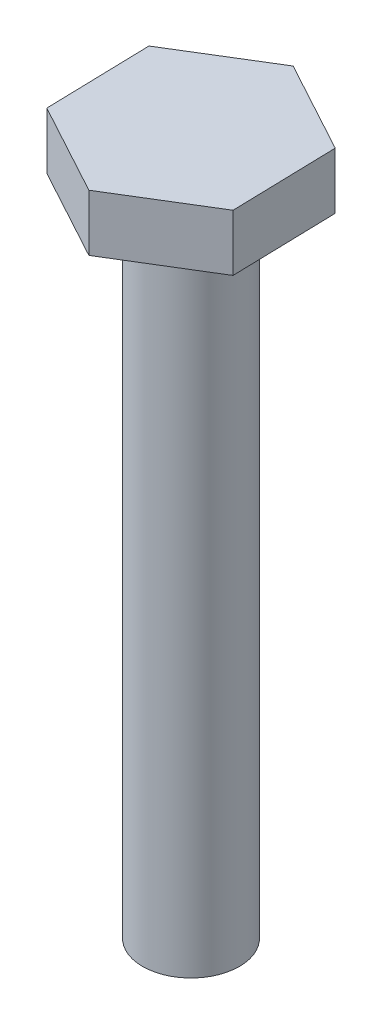
ISO-10303-21;
HEADER;
FILE_DESCRIPTION(('STEP AP214'),'2;1');
FILE_NAME('part.step','',(''),(''),'','','');
FILE_SCHEMA(('AUTOMOTIVE_DESIGN { 1 0 10303 214 1 1 1 1 }'));
ENDSEC;
DATA;
#1=APPLICATION_CONTEXT('core data for automotive mechanical design processes');
#2=APPLICATION_PROTOCOL_DEFINITION('international standard','automotive_design',2000,#1);
#3=PRODUCT_CONTEXT('',#1,'mechanical');
#4=PRODUCT('Part','Part','',(#3));
#5=PRODUCT_RELATED_PRODUCT_CATEGORY('part','',(#4));
#6=PRODUCT_DEFINITION_FORMATION('','',#4);
#7=PRODUCT_DEFINITION_CONTEXT('part definition',#1,'design');
#8=PRODUCT_DEFINITION('design','',#6,#7);
#9=PRODUCT_DEFINITION_SHAPE('','',#8);
#10=(LENGTH_UNIT() NAMED_UNIT(*) SI_UNIT(.MILLI.,.METRE.));
#11=(NAMED_UNIT(*) PLANE_ANGLE_UNIT() SI_UNIT($,.RADIAN.));
#12=(NAMED_UNIT(*) SI_UNIT($,.STERADIAN.) SOLID_ANGLE_UNIT());
#13=UNCERTAINTY_MEASURE_WITH_UNIT(LENGTH_MEASURE(1.E-05),#10,'distance_accuracy_value','');
#14=(GEOMETRIC_REPRESENTATION_CONTEXT(3) GLOBAL_UNCERTAINTY_ASSIGNED_CONTEXT((#13)) GLOBAL_UNIT_ASSIGNED_CONTEXT((#10,
#11,#12)) REPRESENTATION_CONTEXT('',''));
#15=CARTESIAN_POINT('',(0.,0.,0.));
#16=DIRECTION('',(0.,0.,1.));
#17=DIRECTION('',(1.,0.,0.));
#18=AXIS2_PLACEMENT_3D('',#15,#16,#17);
#19=CARTESIAN_POINT('',(-0.167873016872767,3.5,-6.49783184225368));
#20=DIRECTION('',(-0.477466711370013,0.,0.878649838976543));
#21=DIRECTION('',(-0.878649838976543,0.,-0.477466711370013));
#22=AXIS2_PLACEMENT_3D('',#19,#20,#21);
#23=PLANE('',#22);
#24=DIRECTION('',(0.878649838976543,0.,0.477466711370013));
#25=VECTOR('',#24,1.);
#26=CARTESIAN_POINT('',(-0.167873016872767,0.,-6.49783184225368));
#27=LINE('',#26,#25);
#28=CARTESIAN_POINT('',(-0.167873016872767,0.,-6.49783184225368));
#29=VERTEX_POINT('',#28);
#30=CARTESIAN_POINT('',(5.54335093647476,0.,-3.3942982183486));
#31=VERTEX_POINT('',#30);
#32=EDGE_CURVE('E120',#29,#31,#27,.T.);
#33=ORIENTED_EDGE('',*,*,#32,.F.);
#34=DIRECTION('',(0.,-1.,0.));
#35=VECTOR('',#34,1.);
#36=CARTESIAN_POINT('',(-0.167873016872767,3.5,-6.49783184225368));
#37=LINE('',#36,#35);
#38=CARTESIAN_POINT('',(-0.167873016872767,3.5,-6.49783184225368));
#39=VERTEX_POINT('',#38);
#40=EDGE_CURVE('E119',#39,#29,#37,.T.);
#41=ORIENTED_EDGE('',*,*,#40,.F.);
#42=DIRECTION('',(0.878649838976543,0.,0.477466711370013));
#43=VECTOR('',#42,1.);
#44=CARTESIAN_POINT('',(-0.167873016872767,3.5,-6.49783184225368));
#45=LINE('',#44,#43);
#46=CARTESIAN_POINT('',(5.54335093647476,3.5,-3.3942982183486));
#47=VERTEX_POINT('',#46);
#48=EDGE_CURVE('E133',#39,#47,#45,.T.);
#49=ORIENTED_EDGE('',*,*,#48,.T.);
#50=DIRECTION('',(0.,-1.,0.));
#51=VECTOR('',#50,1.);
#52=CARTESIAN_POINT('',(5.54335093647476,3.5,-3.3942982183486));
#53=LINE('',#52,#51);
#54=EDGE_CURVE('E45',#47,#31,#53,.T.);
#55=ORIENTED_EDGE('',*,*,#54,.T.);
#56=EDGE_LOOP('',(#33,#41,#49,#55));
#57=FACE_BOUND('',#56,.T.);
#58=ADVANCED_FACE('F37',(#57),#23,.F.);
#59=CARTESIAN_POINT('',(5.54335093647476,3.5,-3.3942982183486));
#60=DIRECTION('',(-0.999666437269799,0.,0.0258266179804261));
#61=DIRECTION('',(-0.0258266179804261,0.,-0.999666437269799));
#62=AXIS2_PLACEMENT_3D('',#59,#60,#61);
#63=PLANE('',#62);
#64=DIRECTION('',(0.0258266179804261,0.,0.999666437269799));
#65=VECTOR('',#64,1.);
#66=CARTESIAN_POINT('',(5.54335093647476,0.,-3.3942982183486));
#67=LINE('',#66,#65);
#68=CARTESIAN_POINT('',(5.71122395334753,0.,3.10353362390509));
#69=VERTEX_POINT('',#68);
#70=EDGE_CURVE('E122',#31,#69,#67,.T.);
#71=ORIENTED_EDGE('',*,*,#70,.F.);
#72=ORIENTED_EDGE('',*,*,#54,.F.);
#73=DIRECTION('',(0.0258266179804261,0.,0.999666437269799));
#74=VECTOR('',#73,1.);
#75=CARTESIAN_POINT('',(5.54335093647476,3.5,-3.3942982183486));
#76=LINE('',#75,#74);
#77=CARTESIAN_POINT('',(5.71122395334753,3.5,3.10353362390509));
#78=VERTEX_POINT('',#77);
#79=EDGE_CURVE('E85',#47,#78,#76,.T.);
#80=ORIENTED_EDGE('',*,*,#79,.T.);
#81=DIRECTION('',(0.,-1.,0.));
#82=VECTOR('',#81,1.);
#83=CARTESIAN_POINT('',(5.71122395334753,3.5,3.10353362390509));
#84=LINE('',#83,#82);
#85=EDGE_CURVE('E137',#78,#69,#84,.T.);
#86=ORIENTED_EDGE('',*,*,#85,.T.);
#87=EDGE_LOOP('',(#71,#72,#80,#86));
#88=FACE_BOUND('',#87,.T.);
#89=ADVANCED_FACE('F146',(#88),#63,.F.);
#90=CARTESIAN_POINT('',(5.71122395334753,3.5,3.10353362390509));
#91=DIRECTION('',(-0.522199725899786,0.,-0.852823220996115));
#92=DIRECTION('',(0.852823220996115,0.,-0.522199725899786));
#93=AXIS2_PLACEMENT_3D('',#90,#91,#92);
#94=PLANE('',#93);
#95=DIRECTION('',(-0.852823220996115,0.,0.522199725899786));
#96=VECTOR('',#95,1.);
#97=CARTESIAN_POINT('',(5.71122395334753,0.,3.10353362390509));
#98=LINE('',#97,#96);
#99=CARTESIAN_POINT('',(0.167873016872779,0.,6.49783184225369));
#100=VERTEX_POINT('',#99);
#101=EDGE_CURVE('E126',#69,#100,#98,.T.);
#102=ORIENTED_EDGE('',*,*,#101,.F.);
#103=ORIENTED_EDGE('',*,*,#85,.F.);
#104=DIRECTION('',(-0.852823220996115,0.,0.522199725899786));
#105=VECTOR('',#104,1.);
#106=CARTESIAN_POINT('',(5.71122395334753,3.5,3.10353362390509));
#107=LINE('',#106,#105);
#108=CARTESIAN_POINT('',(0.167873016872779,3.5,6.49783184225369));
#109=VERTEX_POINT('',#108);
#110=EDGE_CURVE('E113',#78,#109,#107,.T.);
#111=ORIENTED_EDGE('',*,*,#110,.T.);
#112=DIRECTION('',(0.,-1.,0.));
#113=VECTOR('',#112,1.);
#114=CARTESIAN_POINT('',(0.167873016872779,3.5,6.49783184225369));
#115=LINE('',#114,#113);
#116=EDGE_CURVE('E107',#109,#100,#115,.T.);
#117=ORIENTED_EDGE('',*,*,#116,.T.);
#118=EDGE_LOOP('',(#102,#103,#111,#117));
#119=FACE_BOUND('',#118,.T.);
#120=ADVANCED_FACE('F149',(#119),#94,.F.);
#121=CARTESIAN_POINT('',(0.167873016872779,3.5,6.49783184225369));
#122=DIRECTION('',(0.477466711370013,0.,-0.878649838976543));
#123=DIRECTION('',(0.878649838976543,0.,0.477466711370013));
#124=AXIS2_PLACEMENT_3D('',#121,#122,#123);
#125=PLANE('',#124);
#126=DIRECTION('',(-0.878649838976543,0.,-0.477466711370013));
#127=VECTOR('',#126,1.);
#128=CARTESIAN_POINT('',(0.167873016872779,0.,6.49783184225369));
#129=LINE('',#128,#127);
#130=CARTESIAN_POINT('',(-5.54335093647474,0.,3.39429821834861));
#131=VERTEX_POINT('',#130);
#132=EDGE_CURVE('E129',#100,#131,#129,.T.);
#133=ORIENTED_EDGE('',*,*,#132,.F.);
#134=ORIENTED_EDGE('',*,*,#116,.F.);
#135=DIRECTION('',(-0.878649838976543,0.,-0.477466711370013));
#136=VECTOR('',#135,1.);
#137=CARTESIAN_POINT('',(0.167873016872779,3.5,6.49783184225369));
#138=LINE('',#137,#136);
#139=CARTESIAN_POINT('',(-5.54335093647474,3.5,3.39429821834861));
#140=VERTEX_POINT('',#139);
#141=EDGE_CURVE('E97',#109,#140,#138,.T.);
#142=ORIENTED_EDGE('',*,*,#141,.T.);
#143=DIRECTION('',(0.,-1.,0.));
#144=VECTOR('',#143,1.);
#145=CARTESIAN_POINT('',(-5.54335093647474,3.5,3.39429821834861));
#146=LINE('',#145,#144);
#147=EDGE_CURVE('E102',#140,#131,#146,.T.);
#148=ORIENTED_EDGE('',*,*,#147,.T.);
#149=EDGE_LOOP('',(#133,#134,#142,#148));
#150=FACE_BOUND('',#149,.T.);
#151=ADVANCED_FACE('F110',(#150),#125,.F.);
#152=CARTESIAN_POINT('',(-5.54335093647474,3.5,3.39429821834861));
#153=DIRECTION('',(0.999666437269799,0.,-0.0258266179804277));
#154=DIRECTION('',(0.0258266179804277,0.,0.999666437269799));
#155=AXIS2_PLACEMENT_3D('',#152,#153,#154);
#156=PLANE('',#155);
#157=DIRECTION('',(-0.0258266179804277,0.,-0.999666437269799));
#158=VECTOR('',#157,1.);
#159=CARTESIAN_POINT('',(-5.54335093647474,0.,3.39429821834861));
#160=LINE('',#159,#158);
#161=CARTESIAN_POINT('',(-5.71122395334752,0.,-3.10353362390507));
#162=VERTEX_POINT('',#161);
#163=EDGE_CURVE('E104',#131,#162,#160,.T.);
#164=ORIENTED_EDGE('',*,*,#163,.F.);
#165=ORIENTED_EDGE('',*,*,#147,.F.);
#166=DIRECTION('',(-0.0258266179804277,0.,-0.999666437269799));
#167=VECTOR('',#166,1.);
#168=CARTESIAN_POINT('',(-5.54335093647474,3.5,3.39429821834861));
#169=LINE('',#168,#167);
#170=CARTESIAN_POINT('',(-5.71122395334752,3.5,-3.10353362390507));
#171=VERTEX_POINT('',#170);
#172=EDGE_CURVE('E93',#140,#171,#169,.T.);
#173=ORIENTED_EDGE('',*,*,#172,.T.);
#174=DIRECTION('',(0.,-1.,0.));
#175=VECTOR('',#174,1.);
#176=CARTESIAN_POINT('',(-5.71122395334752,3.5,-3.10353362390507));
#177=LINE('',#176,#175);
#178=EDGE_CURVE('E108',#171,#162,#177,.T.);
#179=ORIENTED_EDGE('',*,*,#178,.T.);
#180=EDGE_LOOP('',(#164,#165,#173,#179));
#181=FACE_BOUND('',#180,.T.);
#182=ADVANCED_FACE('F103',(#181),#156,.F.);
#183=CARTESIAN_POINT('',(-5.71122395334752,3.5,-3.10353362390507));
#184=DIRECTION('',(0.522199725899786,0.,0.852823220996115));
#185=DIRECTION('',(-0.852823220996115,0.,0.522199725899786));
#186=AXIS2_PLACEMENT_3D('',#183,#184,#185);
#187=PLANE('',#186);
#188=DIRECTION('',(0.852823220996115,0.,-0.522199725899786));
#189=VECTOR('',#188,1.);
#190=CARTESIAN_POINT('',(-5.71122395334752,0.,-3.10353362390507));
#191=LINE('',#190,#189);
#192=EDGE_CURVE('E73',#162,#29,#191,.T.);
#193=ORIENTED_EDGE('',*,*,#192,.F.);
#194=ORIENTED_EDGE('',*,*,#178,.F.);
#195=DIRECTION('',(0.852823220996115,0.,-0.522199725899786));
#196=VECTOR('',#195,1.);
#197=CARTESIAN_POINT('',(-5.71122395334752,3.5,-3.10353362390507));
#198=LINE('',#197,#196);
#199=EDGE_CURVE('E53',#171,#39,#198,.T.);
#200=ORIENTED_EDGE('',*,*,#199,.T.);
#201=ORIENTED_EDGE('',*,*,#40,.T.);
#202=EDGE_LOOP('',(#193,#194,#200,#201));
#203=FACE_BOUND('',#202,.T.);
#204=ADVANCED_FACE('F183',(#203),#187,.F.);
#205=CARTESIAN_POINT('',(0.,3.5,0.));
#206=DIRECTION('',(0.,1.,0.));
#207=DIRECTION('',(0.,0.,-1.));
#208=AXIS2_PLACEMENT_3D('',#205,#206,#207);
#209=PLANE('',#208);
#210=ORIENTED_EDGE('',*,*,#48,.F.);
#211=ORIENTED_EDGE('',*,*,#199,.F.);
#212=ORIENTED_EDGE('',*,*,#172,.F.);
#213=ORIENTED_EDGE('',*,*,#141,.F.);
#214=ORIENTED_EDGE('',*,*,#110,.F.);
#215=ORIENTED_EDGE('',*,*,#79,.F.);
#216=EDGE_LOOP('',(#210,#211,#212,#213,#214,#215));
#217=FACE_BOUND('',#216,.T.);
#218=ADVANCED_FACE('F95',(#217),#209,.T.);
#219=CARTESIAN_POINT('',(0.,0.,0.));
#220=DIRECTION('',(0.,1.,0.));
#221=DIRECTION('',(0.,0.,-1.));
#222=AXIS2_PLACEMENT_3D('',#219,#220,#221);
#223=PLANE('',#222);
#224=CARTESIAN_POINT('',(0.,0.,0.));
#225=DIRECTION('',(0.,-1.,0.));
#226=DIRECTION('',(0.,0.,-1.));
#227=AXIS2_PLACEMENT_3D('',#224,#225,#226);
#228=CIRCLE('',#227,3.);
#229=CARTESIAN_POINT('',(0.,0.,-3.));
#230=VERTEX_POINT('',#229);
#231=EDGE_CURVE('E11',#230,#230,#228,.F.);
#232=ORIENTED_EDGE('',*,*,#231,.T.);
#233=EDGE_LOOP('',(#232));
#234=FACE_BOUND('',#233,.T.);
#235=ORIENTED_EDGE('',*,*,#32,.T.);
#236=ORIENTED_EDGE('',*,*,#70,.T.);
#237=ORIENTED_EDGE('',*,*,#101,.T.);
#238=ORIENTED_EDGE('',*,*,#132,.T.);
#239=ORIENTED_EDGE('',*,*,#163,.T.);
#240=ORIENTED_EDGE('',*,*,#192,.T.);
#241=EDGE_LOOP('',(#235,#236,#237,#238,#239,#240));
#242=FACE_BOUND('',#241,.T.);
#243=ADVANCED_FACE('F145',(#234,#242),#223,.F.);
#244=CARTESIAN_POINT('',(0.,-40.,0.));
#245=DIRECTION('',(0.,1.,0.));
#246=DIRECTION('',(0.,0.,-1.));
#247=AXIS2_PLACEMENT_3D('',#244,#245,#246);
#248=CYLINDRICAL_SURFACE('',#247,3.);
#249=CARTESIAN_POINT('',(0.,-40.,0.));
#250=DIRECTION('',(0.,1.,0.));
#251=DIRECTION('',(0.,0.,1.));
#252=AXIS2_PLACEMENT_3D('',#249,#250,#251);
#253=CIRCLE('',#252,3.);
#254=CARTESIAN_POINT('',(0.,-40.,3.));
#255=VERTEX_POINT('',#254);
#256=EDGE_CURVE('E123',#255,#255,#253,.T.);
#257=ORIENTED_EDGE('',*,*,#256,.T.);
#258=EDGE_LOOP('',(#257));
#259=FACE_BOUND('',#258,.T.);
#260=ORIENTED_EDGE('',*,*,#231,.F.);
#261=EDGE_LOOP('',(#260));
#262=FACE_BOUND('',#261,.T.);
#263=ADVANCED_FACE('F208',(#259,#262),#248,.T.);
#264=CARTESIAN_POINT('',(0.,-40.,0.));
#265=DIRECTION('',(0.,-1.,0.));
#266=DIRECTION('',(0.,0.,1.));
#267=AXIS2_PLACEMENT_3D('',#264,#265,#266);
#268=PLANE('',#267);
#269=ORIENTED_EDGE('',*,*,#256,.F.);
#270=EDGE_LOOP('',(#269));
#271=FACE_BOUND('',#270,.T.);
#272=ADVANCED_FACE('F218',(#271),#268,.T.);
#273=CLOSED_SHELL('',(#58,#89,#120,#151,#182,#204,#218,#243,#263,#272));
#274=MANIFOLD_SOLID_BREP('B2',#273);
#275=ADVANCED_BREP_SHAPE_REPRESENTATION('',(#18,#274),#14);
#276=SHAPE_DEFINITION_REPRESENTATION(#9,#275);
ENDSEC;
END-ISO-10303-21;
